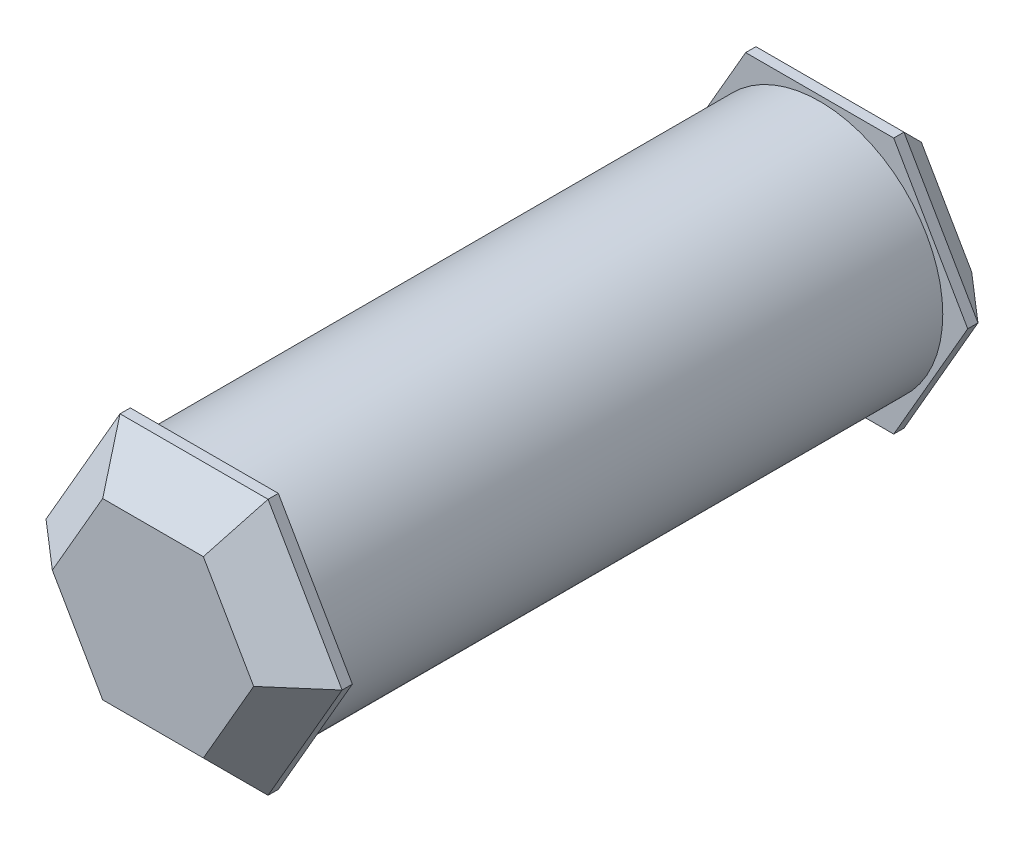
ISO-10303-21;
HEADER;
FILE_DESCRIPTION(('STEP AP214'),'2;1');
FILE_NAME('part.step','',(''),(''),'','','');
FILE_SCHEMA(('AUTOMOTIVE_DESIGN { 1 0 10303 214 1 1 1 1 }'));
ENDSEC;
DATA;
#1=APPLICATION_CONTEXT('core data for automotive mechanical design processes');
#2=APPLICATION_PROTOCOL_DEFINITION('international standard','automotive_design',2000,#1);
#3=PRODUCT_CONTEXT('',#1,'mechanical');
#4=PRODUCT('Part','Part','',(#3));
#5=PRODUCT_RELATED_PRODUCT_CATEGORY('part','',(#4));
#6=PRODUCT_DEFINITION_FORMATION('','',#4);
#7=PRODUCT_DEFINITION_CONTEXT('part definition',#1,'design');
#8=PRODUCT_DEFINITION('design','',#6,#7);
#9=PRODUCT_DEFINITION_SHAPE('','',#8);
#10=(LENGTH_UNIT() NAMED_UNIT(*) SI_UNIT(.MILLI.,.METRE.));
#11=(NAMED_UNIT(*) PLANE_ANGLE_UNIT() SI_UNIT($,.RADIAN.));
#12=(NAMED_UNIT(*) SI_UNIT($,.STERADIAN.) SOLID_ANGLE_UNIT());
#13=UNCERTAINTY_MEASURE_WITH_UNIT(LENGTH_MEASURE(1.E-05),#10,'distance_accuracy_value','');
#14=(GEOMETRIC_REPRESENTATION_CONTEXT(3) GLOBAL_UNCERTAINTY_ASSIGNED_CONTEXT((#13)) GLOBAL_UNIT_ASSIGNED_CONTEXT((#10,
#11,#12)) REPRESENTATION_CONTEXT('',''));
#15=CARTESIAN_POINT('',(0.,0.,0.));
#16=DIRECTION('',(0.,0.,1.));
#17=DIRECTION('',(1.,0.,0.));
#18=AXIS2_PLACEMENT_3D('',#15,#16,#17);
#19=CARTESIAN_POINT('',(0.,0.,6.));
#20=DIRECTION('',(0.,0.,-1.));
#21=DIRECTION('',(-1.,0.,0.));
#22=AXIS2_PLACEMENT_3D('',#19,#20,#21);
#23=CYLINDRICAL_SURFACE('',#22,1.2);
#24=CARTESIAN_POINT('',(0.,0.,6.));
#25=DIRECTION('',(0.,0.,1.));
#26=DIRECTION('',(1.,0.,0.));
#27=AXIS2_PLACEMENT_3D('',#24,#25,#26);
#28=CIRCLE('',#27,1.2);
#29=CARTESIAN_POINT('',(1.2,0.,6.));
#30=VERTEX_POINT('',#29);
#31=EDGE_CURVE('E269',#30,#30,#28,.T.);
#32=ORIENTED_EDGE('',*,*,#31,.F.);
#33=EDGE_LOOP('',(#32));
#34=FACE_BOUND('',#33,.T.);
#35=CARTESIAN_POINT('',(0.,0.,0.));
#36=DIRECTION('',(0.,0.,1.));
#37=DIRECTION('',(1.,0.,0.));
#38=AXIS2_PLACEMENT_3D('',#35,#36,#37);
#39=CIRCLE('',#38,1.2);
#40=CARTESIAN_POINT('',(1.2,0.,0.));
#41=VERTEX_POINT('',#40);
#42=EDGE_CURVE('E181',#41,#41,#39,.T.);
#43=ORIENTED_EDGE('',*,*,#42,.T.);
#44=EDGE_LOOP('',(#43));
#45=FACE_BOUND('',#44,.T.);
#46=ADVANCED_FACE('F44',(#34,#45),#23,.T.);
#47=CARTESIAN_POINT('',(0.721687836487033,-1.25,6.5));
#48=DIRECTION('',(-0.866025403784439,0.5,0.));
#49=DIRECTION('',(-0.5,-0.866025403784439,0.));
#50=AXIS2_PLACEMENT_3D('',#47,#48,#49);
#51=PLANE('',#50);
#52=DIRECTION('',(0.,0.,-1.));
#53=VECTOR('',#52,1.);
#54=CARTESIAN_POINT('',(1.44337567297407,0.,6.5));
#55=LINE('',#54,#53);
#56=CARTESIAN_POINT('',(1.44337567297407,0.,6.1));
#57=VERTEX_POINT('',#56);
#58=CARTESIAN_POINT('',(1.44337567297407,0.,6.));
#59=VERTEX_POINT('',#58);
#60=EDGE_CURVE('E266',#57,#59,#55,.T.);
#61=ORIENTED_EDGE('',*,*,#60,.F.);
#62=DIRECTION('',(-0.5,-0.866025403784439,0.));
#63=VECTOR('',#62,1.);
#64=CARTESIAN_POINT('',(0.721687836487033,-1.25,6.1));
#65=LINE('',#64,#63);
#66=CARTESIAN_POINT('',(0.721687836487033,-1.25,6.1));
#67=VERTEX_POINT('',#66);
#68=EDGE_CURVE('E300',#57,#67,#65,.T.);
#69=ORIENTED_EDGE('',*,*,#68,.T.);
#70=DIRECTION('',(0.,0.,-1.));
#71=VECTOR('',#70,1.);
#72=CARTESIAN_POINT('',(0.721687836487033,-1.25,6.5));
#73=LINE('',#72,#71);
#74=CARTESIAN_POINT('',(0.721687836487033,-1.25,6.));
#75=VERTEX_POINT('',#74);
#76=EDGE_CURVE('E251',#67,#75,#73,.T.);
#77=ORIENTED_EDGE('',*,*,#76,.T.);
#78=DIRECTION('',(0.5,0.866025403784439,0.));
#79=VECTOR('',#78,1.);
#80=CARTESIAN_POINT('',(0.721687836487033,-1.25,6.));
#81=LINE('',#80,#79);
#82=EDGE_CURVE('E227',#75,#59,#81,.T.);
#83=ORIENTED_EDGE('',*,*,#82,.T.);
#84=EDGE_LOOP('',(#61,#69,#77,#83));
#85=FACE_BOUND('',#84,.T.);
#86=ADVANCED_FACE('F433',(#85),#51,.F.);
#87=CARTESIAN_POINT('',(1.44337567297407,0.,6.5));
#88=DIRECTION('',(-0.866025403784439,-0.5,0.));
#89=DIRECTION('',(0.5,-0.866025403784439,0.));
#90=AXIS2_PLACEMENT_3D('',#87,#88,#89);
#91=PLANE('',#90);
#92=DIRECTION('',(0.,0.,-1.));
#93=VECTOR('',#92,1.);
#94=CARTESIAN_POINT('',(0.721687836487032,1.25,6.5));
#95=LINE('',#94,#93);
#96=CARTESIAN_POINT('',(0.721687836487032,1.25,6.1));
#97=VERTEX_POINT('',#96);
#98=CARTESIAN_POINT('',(0.721687836487032,1.25,6.));
#99=VERTEX_POINT('',#98);
#100=EDGE_CURVE('E263',#97,#99,#95,.T.);
#101=ORIENTED_EDGE('',*,*,#100,.F.);
#102=DIRECTION('',(0.5,-0.866025403784439,0.));
#103=VECTOR('',#102,1.);
#104=CARTESIAN_POINT('',(1.44337567297407,0.,6.1));
#105=LINE('',#104,#103);
#106=EDGE_CURVE('E290',#97,#57,#105,.T.);
#107=ORIENTED_EDGE('',*,*,#106,.T.);
#108=ORIENTED_EDGE('',*,*,#60,.T.);
#109=DIRECTION('',(-0.5,0.866025403784438,0.));
#110=VECTOR('',#109,1.);
#111=CARTESIAN_POINT('',(1.44337567297407,0.,6.));
#112=LINE('',#111,#110);
#113=EDGE_CURVE('E231',#59,#99,#112,.T.);
#114=ORIENTED_EDGE('',*,*,#113,.T.);
#115=EDGE_LOOP('',(#101,#107,#108,#114));
#116=FACE_BOUND('',#115,.T.);
#117=ADVANCED_FACE('F439',(#116),#91,.F.);
#118=CARTESIAN_POINT('',(0.721687836487032,1.25,6.5));
#119=DIRECTION('',(0.,-1.,0.));
#120=DIRECTION('',(1.,0.,0.));
#121=AXIS2_PLACEMENT_3D('',#118,#119,#120);
#122=PLANE('',#121);
#123=DIRECTION('',(0.,0.,-1.));
#124=VECTOR('',#123,1.);
#125=CARTESIAN_POINT('',(-0.721687836487033,1.25,6.5));
#126=LINE('',#125,#124);
#127=CARTESIAN_POINT('',(-0.721687836487033,1.25,6.1));
#128=VERTEX_POINT('',#127);
#129=CARTESIAN_POINT('',(-0.721687836487033,1.25,6.));
#130=VERTEX_POINT('',#129);
#131=EDGE_CURVE('E260',#128,#130,#126,.T.);
#132=ORIENTED_EDGE('',*,*,#131,.F.);
#133=DIRECTION('',(1.,0.,0.));
#134=VECTOR('',#133,1.);
#135=CARTESIAN_POINT('',(0.721687836487032,1.25,6.1));
#136=LINE('',#135,#134);
#137=EDGE_CURVE('E280',#128,#97,#136,.T.);
#138=ORIENTED_EDGE('',*,*,#137,.T.);
#139=ORIENTED_EDGE('',*,*,#100,.T.);
#140=DIRECTION('',(-1.,0.,0.));
#141=VECTOR('',#140,1.);
#142=CARTESIAN_POINT('',(0.721687836487032,1.25,6.));
#143=LINE('',#142,#141);
#144=EDGE_CURVE('E235',#99,#130,#143,.T.);
#145=ORIENTED_EDGE('',*,*,#144,.T.);
#146=EDGE_LOOP('',(#132,#138,#139,#145));
#147=FACE_BOUND('',#146,.T.);
#148=ADVANCED_FACE('F668',(#147),#122,.F.);
#149=CARTESIAN_POINT('',(-0.721687836487033,1.25,6.5));
#150=DIRECTION('',(0.866025403784439,-0.499999999999999,0.));
#151=DIRECTION('',(0.5,0.866025403784439,0.));
#152=AXIS2_PLACEMENT_3D('',#149,#150,#151);
#153=PLANE('',#152);
#154=DIRECTION('',(0.,0.,-1.));
#155=VECTOR('',#154,1.);
#156=CARTESIAN_POINT('',(-1.44337567297407,0.,6.5));
#157=LINE('',#156,#155);
#158=CARTESIAN_POINT('',(-1.44337567297407,0.,6.1));
#159=VERTEX_POINT('',#158);
#160=CARTESIAN_POINT('',(-1.44337567297407,0.,6.));
#161=VERTEX_POINT('',#160);
#162=EDGE_CURVE('E257',#159,#161,#157,.T.);
#163=ORIENTED_EDGE('',*,*,#162,.F.);
#164=DIRECTION('',(0.5,0.866025403784439,0.));
#165=VECTOR('',#164,1.);
#166=CARTESIAN_POINT('',(-0.952627944162883,0.850000000000001,6.1));
#167=LINE('',#166,#165);
#168=EDGE_CURVE('E331',#159,#128,#167,.T.);
#169=ORIENTED_EDGE('',*,*,#168,.T.);
#170=ORIENTED_EDGE('',*,*,#131,.T.);
#171=DIRECTION('',(-0.499999999999999,-0.866025403784439,0.));
#172=VECTOR('',#171,1.);
#173=CARTESIAN_POINT('',(-0.721687836487033,1.25,6.));
#174=LINE('',#173,#172);
#175=EDGE_CURVE('E239',#130,#161,#174,.T.);
#176=ORIENTED_EDGE('',*,*,#175,.T.);
#177=EDGE_LOOP('',(#163,#169,#170,#176));
#178=FACE_BOUND('',#177,.T.);
#179=ADVANCED_FACE('F657',(#178),#153,.F.);
#180=CARTESIAN_POINT('',(-1.44337567297407,0.,6.5));
#181=DIRECTION('',(0.866025403784439,0.5,0.));
#182=DIRECTION('',(-0.5,0.866025403784439,0.));
#183=AXIS2_PLACEMENT_3D('',#180,#181,#182);
#184=PLANE('',#183);
#185=DIRECTION('',(0.,0.,-1.));
#186=VECTOR('',#185,1.);
#187=CARTESIAN_POINT('',(-0.721687836487033,-1.25,6.5));
#188=LINE('',#187,#186);
#189=CARTESIAN_POINT('',(-0.721687836487033,-1.25,6.1));
#190=VERTEX_POINT('',#189);
#191=CARTESIAN_POINT('',(-0.721687836487033,-1.25,6.));
#192=VERTEX_POINT('',#191);
#193=EDGE_CURVE('E254',#190,#192,#188,.T.);
#194=ORIENTED_EDGE('',*,*,#193,.F.);
#195=DIRECTION('',(-0.5,0.866025403784439,0.));
#196=VECTOR('',#195,1.);
#197=CARTESIAN_POINT('',(-1.44337567297407,0.,6.1));
#198=LINE('',#197,#196);
#199=EDGE_CURVE('E320',#190,#159,#198,.T.);
#200=ORIENTED_EDGE('',*,*,#199,.T.);
#201=ORIENTED_EDGE('',*,*,#162,.T.);
#202=DIRECTION('',(0.5,-0.866025403784439,0.));
#203=VECTOR('',#202,1.);
#204=CARTESIAN_POINT('',(-1.44337567297407,0.,6.));
#205=LINE('',#204,#203);
#206=EDGE_CURVE('E243',#161,#192,#205,.T.);
#207=ORIENTED_EDGE('',*,*,#206,.T.);
#208=EDGE_LOOP('',(#194,#200,#201,#207));
#209=FACE_BOUND('',#208,.T.);
#210=ADVANCED_FACE('F652',(#209),#184,.F.);
#211=CARTESIAN_POINT('',(-0.721687836487033,-1.25,6.5));
#212=DIRECTION('',(0.,1.,0.));
#213=DIRECTION('',(0.,0.,1.));
#214=AXIS2_PLACEMENT_3D('',#211,#212,#213);
#215=PLANE('',#214);
#216=ORIENTED_EDGE('',*,*,#76,.F.);
#217=DIRECTION('',(-1.,0.,0.));
#218=VECTOR('',#217,1.);
#219=CARTESIAN_POINT('',(-0.721687836487033,-1.25,6.1));
#220=LINE('',#219,#218);
#221=EDGE_CURVE('E310',#67,#190,#220,.T.);
#222=ORIENTED_EDGE('',*,*,#221,.T.);
#223=ORIENTED_EDGE('',*,*,#193,.T.);
#224=DIRECTION('',(1.,0.,0.));
#225=VECTOR('',#224,1.);
#226=CARTESIAN_POINT('',(-0.721687836487033,-1.25,6.));
#227=LINE('',#226,#225);
#228=EDGE_CURVE('E247',#192,#75,#227,.T.);
#229=ORIENTED_EDGE('',*,*,#228,.T.);
#230=EDGE_LOOP('',(#216,#222,#223,#229));
#231=FACE_BOUND('',#230,.T.);
#232=ADVANCED_FACE('F643',(#231),#215,.F.);
#233=CARTESIAN_POINT('',(0.,0.,6.5));
#234=DIRECTION('',(0.,0.,1.));
#235=DIRECTION('',(1.,0.,0.));
#236=AXIS2_PLACEMENT_3D('',#233,#234,#235);
#237=PLANE('',#236);
#238=DIRECTION('',(-1.,0.,0.));
#239=VECTOR('',#238,1.);
#240=CARTESIAN_POINT('',(-0.721687836487033,0.850000000000001,6.5));
#241=LINE('',#240,#239);
#242=CARTESIAN_POINT('',(0.490747728811182,0.850000000000001,6.5));
#243=VERTEX_POINT('',#242);
#244=CARTESIAN_POINT('',(-0.490747728811184,0.850000000000001,6.5));
#245=VERTEX_POINT('',#244);
#246=EDGE_CURVE('E273',#243,#245,#241,.T.);
#247=ORIENTED_EDGE('',*,*,#246,.T.);
#248=DIRECTION('',(-0.5,-0.866025403784439,0.));
#249=VECTOR('',#248,1.);
#250=CARTESIAN_POINT('',(-0.86602540378444,0.200000000000001,6.5));
#251=LINE('',#250,#249);
#252=CARTESIAN_POINT('',(-0.981495457622365,0.,6.5));
#253=VERTEX_POINT('',#252);
#254=EDGE_CURVE('E324',#245,#253,#251,.T.);
#255=ORIENTED_EDGE('',*,*,#254,.T.);
#256=DIRECTION('',(0.5,-0.866025403784439,0.));
#257=VECTOR('',#256,1.);
#258=CARTESIAN_POINT('',(-0.606217782649107,-0.650000000000001,6.5));
#259=LINE('',#258,#257);
#260=CARTESIAN_POINT('',(-0.490747728811182,-0.850000000000001,6.5));
#261=VERTEX_POINT('',#260);
#262=EDGE_CURVE('E314',#253,#261,#259,.T.);
#263=ORIENTED_EDGE('',*,*,#262,.T.);
#264=DIRECTION('',(1.,0.,0.));
#265=VECTOR('',#264,1.);
#266=CARTESIAN_POINT('',(0.259807621135334,-0.850000000000001,6.5));
#267=LINE('',#266,#265);
#268=CARTESIAN_POINT('',(0.490747728811184,-0.850000000000001,6.5));
#269=VERTEX_POINT('',#268);
#270=EDGE_CURVE('E304',#261,#269,#267,.T.);
#271=ORIENTED_EDGE('',*,*,#270,.T.);
#272=DIRECTION('',(0.5,0.866025403784439,0.));
#273=VECTOR('',#272,1.);
#274=CARTESIAN_POINT('',(0.86602540378444,-0.200000000000001,6.5));
#275=LINE('',#274,#273);
#276=CARTESIAN_POINT('',(0.981495457622366,0.,6.5));
#277=VERTEX_POINT('',#276);
#278=EDGE_CURVE('E294',#269,#277,#275,.T.);
#279=ORIENTED_EDGE('',*,*,#278,.T.);
#280=DIRECTION('',(-0.5,0.866025403784439,0.));
#281=VECTOR('',#280,1.);
#282=CARTESIAN_POINT('',(0.606217782649107,0.650000000000001,6.5));
#283=LINE('',#282,#281);
#284=EDGE_CURVE('E284',#277,#243,#283,.T.);
#285=ORIENTED_EDGE('',*,*,#284,.T.);
#286=EDGE_LOOP('',(#247,#255,#263,#271,#279,#285));
#287=FACE_BOUND('',#286,.T.);
#288=ADVANCED_FACE('F638',(#287),#237,.T.);
#289=CARTESIAN_POINT('',(0.,0.,6.));
#290=DIRECTION('',(0.,0.,1.));
#291=DIRECTION('',(1.,0.,0.));
#292=AXIS2_PLACEMENT_3D('',#289,#290,#291);
#293=PLANE('',#292);
#294=ORIENTED_EDGE('',*,*,#31,.T.);
#295=EDGE_LOOP('',(#294));
#296=FACE_BOUND('',#295,.T.);
#297=ORIENTED_EDGE('',*,*,#82,.F.);
#298=ORIENTED_EDGE('',*,*,#228,.F.);
#299=ORIENTED_EDGE('',*,*,#206,.F.);
#300=ORIENTED_EDGE('',*,*,#175,.F.);
#301=ORIENTED_EDGE('',*,*,#144,.F.);
#302=ORIENTED_EDGE('',*,*,#113,.F.);
#303=EDGE_LOOP('',(#297,#298,#299,#300,#301,#302));
#304=FACE_BOUND('',#303,.T.);
#305=ADVANCED_FACE('F570',(#296,#304),#293,.F.);
#306=CARTESIAN_POINT('',(-0.721687836487047,-1.24999999999999,-0.5));
#307=DIRECTION('',(0.866025403784441,0.499999999999995,0.));
#308=DIRECTION('',(-0.499999999999995,0.866025403784441,0.));
#309=AXIS2_PLACEMENT_3D('',#306,#307,#308);
#310=PLANE('',#309);
#311=DIRECTION('',(0.,0.,1.));
#312=VECTOR('',#311,1.);
#313=CARTESIAN_POINT('',(-1.44337567297407,0.,-0.5));
#314=LINE('',#313,#312);
#315=CARTESIAN_POINT('',(-1.44337567297407,0.,-0.099999999999999));
#316=VERTEX_POINT('',#315);
#317=CARTESIAN_POINT('',(-1.44337567297407,0.,0.));
#318=VERTEX_POINT('',#317);
#319=EDGE_CURVE('E172',#316,#318,#314,.T.);
#320=ORIENTED_EDGE('',*,*,#319,.F.);
#321=DIRECTION('',(0.499999999999995,-0.866025403784441,0.));
#322=VECTOR('',#321,1.);
#323=CARTESIAN_POINT('',(-0.952627944162895,-0.849999999999991,-0.099999999999999));
#324=LINE('',#323,#322);
#325=CARTESIAN_POINT('',(-0.721687836487047,-1.24999999999999,-0.100000000000001));
#326=VERTEX_POINT('',#325);
#327=EDGE_CURVE('E378',#316,#326,#324,.T.);
#328=ORIENTED_EDGE('',*,*,#327,.T.);
#329=DIRECTION('',(0.,0.,1.));
#330=VECTOR('',#329,1.);
#331=CARTESIAN_POINT('',(-0.721687836487047,-1.24999999999999,-0.5));
#332=LINE('',#331,#330);
#333=CARTESIAN_POINT('',(-0.721687836487047,-1.24999999999999,0.));
#334=VERTEX_POINT('',#333);
#335=EDGE_CURVE('E196',#326,#334,#332,.T.);
#336=ORIENTED_EDGE('',*,*,#335,.T.);
#337=DIRECTION('',(-0.499999999999995,0.866025403784441,0.));
#338=VECTOR('',#337,1.);
#339=CARTESIAN_POINT('',(-0.721687836487047,-1.24999999999999,0.));
#340=LINE('',#339,#338);
#341=EDGE_CURVE('E188',#334,#318,#340,.T.);
#342=ORIENTED_EDGE('',*,*,#341,.T.);
#343=EDGE_LOOP('',(#320,#328,#336,#342));
#344=FACE_BOUND('',#343,.T.);
#345=ADVANCED_FACE('F194',(#344),#310,.F.);
#346=CARTESIAN_POINT('',(-1.44337567297407,0.,-0.5));
#347=DIRECTION('',(0.866025403784438,-0.500000000000001,0.));
#348=DIRECTION('',(0.500000000000001,0.866025403784438,0.));
#349=AXIS2_PLACEMENT_3D('',#346,#347,#348);
#350=PLANE('',#349);
#351=DIRECTION('',(0.,0.,1.));
#352=VECTOR('',#351,1.);
#353=CARTESIAN_POINT('',(-0.72168783648703,1.25,-0.5));
#354=LINE('',#353,#352);
#355=CARTESIAN_POINT('',(-0.72168783648703,1.25,-0.100000000000001));
#356=VERTEX_POINT('',#355);
#357=CARTESIAN_POINT('',(-0.72168783648703,1.25,0.));
#358=VERTEX_POINT('',#357);
#359=EDGE_CURVE('E182',#356,#358,#354,.T.);
#360=ORIENTED_EDGE('',*,*,#359,.F.);
#361=DIRECTION('',(-0.500000000000001,-0.866025403784438,0.));
#362=VECTOR('',#361,1.);
#363=CARTESIAN_POINT('',(-1.21243556529821,0.4,-0.099999999999998));
#364=LINE('',#363,#362);
#365=EDGE_CURVE('E54',#356,#316,#364,.T.);
#366=ORIENTED_EDGE('',*,*,#365,.T.);
#367=ORIENTED_EDGE('',*,*,#319,.T.);
#368=DIRECTION('',(0.500000000000001,0.866025403784438,0.));
#369=VECTOR('',#368,1.);
#370=CARTESIAN_POINT('',(-1.44337567297407,0.,0.));
#371=LINE('',#370,#369);
#372=EDGE_CURVE('E176',#318,#358,#371,.T.);
#373=ORIENTED_EDGE('',*,*,#372,.T.);
#374=EDGE_LOOP('',(#360,#366,#367,#373));
#375=FACE_BOUND('',#374,.T.);
#376=ADVANCED_FACE('F175',(#375),#350,.F.);
#377=CARTESIAN_POINT('',(-0.72168783648703,1.25,-0.5));
#378=DIRECTION('',(0.,-1.,0.));
#379=DIRECTION('',(1.,0.,0.));
#380=AXIS2_PLACEMENT_3D('',#377,#378,#379);
#381=PLANE('',#380);
#382=DIRECTION('',(0.,0.,1.));
#383=VECTOR('',#382,1.);
#384=CARTESIAN_POINT('',(0.721687836487038,1.25,-0.5));
#385=LINE('',#384,#383);
#386=CARTESIAN_POINT('',(0.721687836487038,1.25,-0.0999999999999999));
#387=VERTEX_POINT('',#386);
#388=CARTESIAN_POINT('',(0.721687836487038,1.25,0.));
#389=VERTEX_POINT('',#388);
#390=EDGE_CURVE('E222',#387,#389,#385,.T.);
#391=ORIENTED_EDGE('',*,*,#390,.F.);
#392=DIRECTION('',(-1.,0.,0.));
#393=VECTOR('',#392,1.);
#394=CARTESIAN_POINT('',(-0.72168783648703,1.25,-0.100000000000001));
#395=LINE('',#394,#393);
#396=EDGE_CURVE('E361',#387,#356,#395,.T.);
#397=ORIENTED_EDGE('',*,*,#396,.T.);
#398=ORIENTED_EDGE('',*,*,#359,.T.);
#399=DIRECTION('',(1.,0.,0.));
#400=VECTOR('',#399,1.);
#401=CARTESIAN_POINT('',(-0.72168783648703,1.25,0.));
#402=LINE('',#401,#400);
#403=EDGE_CURVE('E191',#358,#389,#402,.T.);
#404=ORIENTED_EDGE('',*,*,#403,.T.);
#405=EDGE_LOOP('',(#391,#397,#398,#404));
#406=FACE_BOUND('',#405,.T.);
#407=ADVANCED_FACE('F396',(#406),#381,.F.);
#408=CARTESIAN_POINT('',(0.721687836487038,1.25,-0.5));
#409=DIRECTION('',(-0.866025403784441,-0.499999999999995,0.));
#410=DIRECTION('',(0.499999999999995,-0.866025403784441,0.));
#411=AXIS2_PLACEMENT_3D('',#408,#409,#410);
#412=PLANE('',#411);
#413=DIRECTION('',(0.,0.,1.));
#414=VECTOR('',#413,1.);
#415=CARTESIAN_POINT('',(1.44337567297406,0.,-0.5));
#416=LINE('',#415,#414);
#417=CARTESIAN_POINT('',(1.44337567297406,0.,-0.0999999999999999));
#418=VERTEX_POINT('',#417);
#419=CARTESIAN_POINT('',(1.44337567297406,0.,0.));
#420=VERTEX_POINT('',#419);
#421=EDGE_CURVE('E219',#418,#420,#416,.T.);
#422=ORIENTED_EDGE('',*,*,#421,.F.);
#423=DIRECTION('',(-0.499999999999995,0.866025403784441,0.));
#424=VECTOR('',#423,1.);
#425=CARTESIAN_POINT('',(0.721687836487038,1.25,-0.0999999999999999));
#426=LINE('',#425,#424);
#427=EDGE_CURVE('E351',#418,#387,#426,.T.);
#428=ORIENTED_EDGE('',*,*,#427,.T.);
#429=ORIENTED_EDGE('',*,*,#390,.T.);
#430=DIRECTION('',(0.499999999999995,-0.866025403784441,0.));
#431=VECTOR('',#430,1.);
#432=CARTESIAN_POINT('',(0.721687836487038,1.25,0.));
#433=LINE('',#432,#431);
#434=EDGE_CURVE('E203',#389,#420,#433,.T.);
#435=ORIENTED_EDGE('',*,*,#434,.T.);
#436=EDGE_LOOP('',(#422,#428,#429,#435));
#437=FACE_BOUND('',#436,.T.);
#438=ADVANCED_FACE('F423',(#437),#412,.F.);
#439=CARTESIAN_POINT('',(1.44337567297406,0.,-0.5));
#440=DIRECTION('',(-0.866025403784435,0.500000000000007,0.));
#441=DIRECTION('',(-0.500000000000007,-0.866025403784435,0.));
#442=AXIS2_PLACEMENT_3D('',#439,#440,#441);
#443=PLANE('',#442);
#444=DIRECTION('',(0.,0.,1.));
#445=VECTOR('',#444,1.);
#446=CARTESIAN_POINT('',(0.721687836487021,-1.25000000000001,-0.5));
#447=LINE('',#446,#445);
#448=CARTESIAN_POINT('',(0.721687836487021,-1.25000000000001,-0.0999999999999999));
#449=VERTEX_POINT('',#448);
#450=CARTESIAN_POINT('',(0.721687836487021,-1.25000000000001,0.));
#451=VERTEX_POINT('',#450);
#452=EDGE_CURVE('E216',#449,#451,#447,.T.);
#453=ORIENTED_EDGE('',*,*,#452,.F.);
#454=DIRECTION('',(0.500000000000007,0.866025403784435,0.));
#455=VECTOR('',#454,1.);
#456=CARTESIAN_POINT('',(1.44337567297406,0.,-0.0999999999999999));
#457=LINE('',#456,#455);
#458=EDGE_CURVE('E341',#449,#418,#457,.T.);
#459=ORIENTED_EDGE('',*,*,#458,.T.);
#460=ORIENTED_EDGE('',*,*,#421,.T.);
#461=DIRECTION('',(-0.500000000000007,-0.866025403784435,0.));
#462=VECTOR('',#461,1.);
#463=CARTESIAN_POINT('',(1.44337567297406,0.,0.));
#464=LINE('',#463,#462);
#465=EDGE_CURVE('E207',#420,#451,#464,.T.);
#466=ORIENTED_EDGE('',*,*,#465,.T.);
#467=EDGE_LOOP('',(#453,#459,#460,#466));
#468=FACE_BOUND('',#467,.T.);
#469=ADVANCED_FACE('F411',(#468),#443,.F.);
#470=CARTESIAN_POINT('',(0.721687836487021,-1.25000000000001,-0.5));
#471=DIRECTION('',(0.,1.,0.));
#472=DIRECTION('',(-1.,0.,0.));
#473=AXIS2_PLACEMENT_3D('',#470,#471,#472);
#474=PLANE('',#473);
#475=ORIENTED_EDGE('',*,*,#335,.F.);
#476=DIRECTION('',(1.,0.,0.));
#477=VECTOR('',#476,1.);
#478=CARTESIAN_POINT('',(0.259807621135323,-1.25,-0.100000000000001));
#479=LINE('',#478,#477);
#480=EDGE_CURVE('E369',#326,#449,#479,.T.);
#481=ORIENTED_EDGE('',*,*,#480,.T.);
#482=ORIENTED_EDGE('',*,*,#452,.T.);
#483=DIRECTION('',(-1.,0.,0.));
#484=VECTOR('',#483,1.);
#485=CARTESIAN_POINT('',(0.721687836487021,-1.25000000000001,0.));
#486=LINE('',#485,#484);
#487=EDGE_CURVE('E211',#451,#334,#486,.T.);
#488=ORIENTED_EDGE('',*,*,#487,.T.);
#489=EDGE_LOOP('',(#475,#481,#482,#488));
#490=FACE_BOUND('',#489,.T.);
#491=ADVANCED_FACE('F408',(#490),#474,.F.);
#492=CARTESIAN_POINT('',(0.,0.,-0.5));
#493=DIRECTION('',(0.,0.,-1.));
#494=DIRECTION('',(-1.,0.,0.));
#495=AXIS2_PLACEMENT_3D('',#492,#493,#494);
#496=PLANE('',#495);
#497=DIRECTION('',(-0.499999999999995,0.866025403784441,0.));
#498=VECTOR('',#497,1.);
#499=CARTESIAN_POINT('',(-1.09696551146029,0.199999999999998,-0.5));
#500=LINE('',#499,#498);
#501=CARTESIAN_POINT('',(-0.490747728811193,-0.849999999999995,-0.5));
#502=VERTEX_POINT('',#501);
#503=CARTESIAN_POINT('',(-0.981495457622365,0.,-0.5));
#504=VERTEX_POINT('',#503);
#505=EDGE_CURVE('E375',#502,#504,#500,.T.);
#506=ORIENTED_EDGE('',*,*,#505,.T.);
#507=DIRECTION('',(0.500000000000001,0.866025403784438,0.));
#508=VECTOR('',#507,1.);
#509=CARTESIAN_POINT('',(-0.606217782649105,0.650000000000003,-0.5));
#510=LINE('',#509,#508);
#511=CARTESIAN_POINT('',(-0.49074772881118,0.850000000000002,-0.5));
#512=VERTEX_POINT('',#511);
#513=EDGE_CURVE('E384',#504,#512,#510,.T.);
#514=ORIENTED_EDGE('',*,*,#513,.T.);
#515=DIRECTION('',(1.,0.,0.));
#516=VECTOR('',#515,1.);
#517=CARTESIAN_POINT('',(0.259807621135339,0.85,-0.5));
#518=LINE('',#517,#516);
#519=CARTESIAN_POINT('',(0.490747728811188,0.849999999999999,-0.5));
#520=VERTEX_POINT('',#519);
#521=EDGE_CURVE('E355',#512,#520,#518,.T.);
#522=ORIENTED_EDGE('',*,*,#521,.T.);
#523=DIRECTION('',(0.499999999999995,-0.866025403784441,0.));
#524=VECTOR('',#523,1.);
#525=CARTESIAN_POINT('',(0.866025403784443,0.199999999999992,-0.5));
#526=LINE('',#525,#524);
#527=CARTESIAN_POINT('',(0.981495457622366,0.,-0.5));
#528=VERTEX_POINT('',#527);
#529=EDGE_CURVE('E345',#520,#528,#526,.T.);
#530=ORIENTED_EDGE('',*,*,#529,.T.);
#531=DIRECTION('',(-0.500000000000007,-0.866025403784435,0.));
#532=VECTOR('',#531,1.);
#533=CARTESIAN_POINT('',(0.375277674973249,-1.05,-0.5));
#534=LINE('',#533,#532);
#535=CARTESIAN_POINT('',(0.490747728811176,-0.850000000000005,-0.5));
#536=VERTEX_POINT('',#535);
#537=EDGE_CURVE('E337',#528,#536,#534,.T.);
#538=ORIENTED_EDGE('',*,*,#537,.T.);
#539=DIRECTION('',(-1.,0.,0.));
#540=VECTOR('',#539,1.);
#541=CARTESIAN_POINT('',(-0.721687836487043,-0.849999999999993,-0.5));
#542=LINE('',#541,#540);
#543=EDGE_CURVE('E365',#536,#502,#542,.T.);
#544=ORIENTED_EDGE('',*,*,#543,.T.);
#545=EDGE_LOOP('',(#506,#514,#522,#530,#538,#544));
#546=FACE_BOUND('',#545,.T.);
#547=ADVANCED_FACE('F398',(#546),#496,.T.);
#548=CARTESIAN_POINT('',(0.,0.,0.));
#549=DIRECTION('',(0.,0.,-1.));
#550=DIRECTION('',(-1.,0.,0.));
#551=AXIS2_PLACEMENT_3D('',#548,#549,#550);
#552=PLANE('',#551);
#553=ORIENTED_EDGE('',*,*,#42,.F.);
#554=EDGE_LOOP('',(#553));
#555=FACE_BOUND('',#554,.T.);
#556=ORIENTED_EDGE('',*,*,#341,.F.);
#557=ORIENTED_EDGE('',*,*,#487,.F.);
#558=ORIENTED_EDGE('',*,*,#465,.F.);
#559=ORIENTED_EDGE('',*,*,#434,.F.);
#560=ORIENTED_EDGE('',*,*,#403,.F.);
#561=ORIENTED_EDGE('',*,*,#372,.F.);
#562=EDGE_LOOP('',(#556,#557,#558,#559,#560,#561));
#563=FACE_BOUND('',#562,.T.);
#564=ADVANCED_FACE('F186',(#555,#563),#552,.F.);
#565=CARTESIAN_POINT('',(0.,0.850000000000001,6.5));
#566=DIRECTION('',(0.,0.707106781186548,0.707106781186547));
#567=DIRECTION('',(1.,0.,0.));
#568=AXIS2_PLACEMENT_3D('',#565,#566,#567);
#569=PLANE('',#568);
#570=ORIENTED_EDGE('',*,*,#137,.F.);
#571=DIRECTION('',(0.377964473009227,-0.654653670707977,0.654653670707978));
#572=VECTOR('',#571,1.);
#573=CARTESIAN_POINT('',(-0.420640910409587,0.728571428571429,6.62142857142857));
#574=LINE('',#573,#572);
#575=EDGE_CURVE('E334',#128,#245,#574,.T.);
#576=ORIENTED_EDGE('',*,*,#575,.T.);
#577=ORIENTED_EDGE('',*,*,#246,.F.);
#578=DIRECTION('',(0.377964473009227,0.654653670707977,-0.654653670707978));
#579=VECTOR('',#578,1.);
#580=CARTESIAN_POINT('',(0.420640910409584,0.72857142857143,6.62142857142857));
#581=LINE('',#580,#579);
#582=EDGE_CURVE('E287',#243,#97,#581,.T.);
#583=ORIENTED_EDGE('',*,*,#582,.T.);
#584=EDGE_LOOP('',(#570,#576,#577,#583));
#585=FACE_BOUND('',#584,.T.);
#586=ADVANCED_FACE('F447',(#585),#569,.T.);
#587=CARTESIAN_POINT('',(0.736121593216773,0.425,6.5));
#588=DIRECTION('',(0.612372435695795,0.353553390593274,0.707106781186547));
#589=DIRECTION('',(0.5,-0.866025403784439,0.));
#590=AXIS2_PLACEMENT_3D('',#587,#588,#589);
#591=PLANE('',#590);
#592=ORIENTED_EDGE('',*,*,#284,.F.);
#593=DIRECTION('',(0.755928946018454,0.,-0.654653670707978));
#594=VECTOR('',#593,1.);
#595=CARTESIAN_POINT('',(0.841281820819171,0.,6.62142857142857));
#596=LINE('',#595,#594);
#597=EDGE_CURVE('E297',#277,#57,#596,.T.);
#598=ORIENTED_EDGE('',*,*,#597,.T.);
#599=ORIENTED_EDGE('',*,*,#106,.F.);
#600=ORIENTED_EDGE('',*,*,#582,.F.);
#601=EDGE_LOOP('',(#592,#598,#599,#600));
#602=FACE_BOUND('',#601,.T.);
#603=ADVANCED_FACE('F453',(#602),#591,.T.);
#604=CARTESIAN_POINT('',(0.736121593216775,-0.425000000000001,6.5));
#605=DIRECTION('',(0.612372435695796,-0.353553390593274,0.707106781186546));
#606=DIRECTION('',(-0.5,-0.866025403784439,0.));
#607=AXIS2_PLACEMENT_3D('',#604,#605,#606);
#608=PLANE('',#607);
#609=ORIENTED_EDGE('',*,*,#278,.F.);
#610=DIRECTION('',(0.377964473009226,-0.654653670707977,-0.654653670707978));
#611=VECTOR('',#610,1.);
#612=CARTESIAN_POINT('',(0.420640910409587,-0.728571428571429,6.62142857142857));
#613=LINE('',#612,#611);
#614=EDGE_CURVE('E307',#269,#67,#613,.T.);
#615=ORIENTED_EDGE('',*,*,#614,.T.);
#616=ORIENTED_EDGE('',*,*,#68,.F.);
#617=ORIENTED_EDGE('',*,*,#597,.F.);
#618=EDGE_LOOP('',(#609,#615,#616,#617));
#619=FACE_BOUND('',#618,.T.);
#620=ADVANCED_FACE('F460',(#619),#608,.T.);
#621=CARTESIAN_POINT('',(0.,-0.850000000000001,6.5));
#622=DIRECTION('',(0.,-0.707106781186548,0.707106781186547));
#623=DIRECTION('',(-1.,0.,0.));
#624=AXIS2_PLACEMENT_3D('',#621,#622,#623);
#625=PLANE('',#624);
#626=ORIENTED_EDGE('',*,*,#270,.F.);
#627=DIRECTION('',(-0.377964473009227,-0.654653670707977,-0.654653670707978));
#628=VECTOR('',#627,1.);
#629=CARTESIAN_POINT('',(-0.420640910409585,-0.728571428571429,6.62142857142857));
#630=LINE('',#629,#628);
#631=EDGE_CURVE('E317',#261,#190,#630,.T.);
#632=ORIENTED_EDGE('',*,*,#631,.T.);
#633=ORIENTED_EDGE('',*,*,#221,.F.);
#634=ORIENTED_EDGE('',*,*,#614,.F.);
#635=EDGE_LOOP('',(#626,#632,#633,#634));
#636=FACE_BOUND('',#635,.T.);
#637=ADVANCED_FACE('F467',(#636),#625,.T.);
#638=CARTESIAN_POINT('',(-0.736121593216773,-0.425,6.5));
#639=DIRECTION('',(-0.612372435695795,-0.353553390593274,0.707106781186547));
#640=DIRECTION('',(-0.5,0.866025403784439,0.));
#641=AXIS2_PLACEMENT_3D('',#638,#639,#640);
#642=PLANE('',#641);
#643=ORIENTED_EDGE('',*,*,#262,.F.);
#644=DIRECTION('',(-0.755928946018454,0.,-0.654653670707978));
#645=VECTOR('',#644,1.);
#646=CARTESIAN_POINT('',(-0.84128182081917,0.,6.62142857142857));
#647=LINE('',#646,#645);
#648=EDGE_CURVE('E328',#253,#159,#647,.T.);
#649=ORIENTED_EDGE('',*,*,#648,.T.);
#650=ORIENTED_EDGE('',*,*,#199,.F.);
#651=ORIENTED_EDGE('',*,*,#631,.F.);
#652=EDGE_LOOP('',(#643,#649,#650,#651));
#653=FACE_BOUND('',#652,.T.);
#654=ADVANCED_FACE('F474',(#653),#642,.T.);
#655=CARTESIAN_POINT('',(-0.736121593216775,0.425000000000001,6.5));
#656=DIRECTION('',(-0.612372435695796,0.353553390593274,0.707106781186546));
#657=DIRECTION('',(0.5,0.866025403784439,0.));
#658=AXIS2_PLACEMENT_3D('',#655,#656,#657);
#659=PLANE('',#658);
#660=ORIENTED_EDGE('',*,*,#575,.F.);
#661=ORIENTED_EDGE('',*,*,#168,.F.);
#662=ORIENTED_EDGE('',*,*,#648,.F.);
#663=ORIENTED_EDGE('',*,*,#254,.F.);
#664=EDGE_LOOP('',(#660,#661,#662,#663));
#665=FACE_BOUND('',#664,.T.);
#666=ADVANCED_FACE('F481',(#665),#659,.T.);
#667=CARTESIAN_POINT('',(0.736121593216771,-0.425000000000006,-0.5));
#668=DIRECTION('',(0.612372435695793,-0.353553390593279,-0.707106781186546));
#669=DIRECTION('',(0.500000000000007,0.866025403784435,0.));
#670=AXIS2_PLACEMENT_3D('',#667,#668,#669);
#671=PLANE('',#670);
#672=ORIENTED_EDGE('',*,*,#458,.F.);
#673=DIRECTION('',(-0.377964473009219,0.654653670707982,-0.654653670707978));
#674=VECTOR('',#673,1.);
#675=CARTESIAN_POINT('',(0.420640910409579,-0.728571428571432,-0.621428571428573));
#676=LINE('',#675,#674);
#677=EDGE_CURVE('E372',#449,#536,#676,.T.);
#678=ORIENTED_EDGE('',*,*,#677,.T.);
#679=ORIENTED_EDGE('',*,*,#537,.F.);
#680=DIRECTION('',(0.755928946018453,0.,0.654653670707979));
#681=VECTOR('',#680,1.);
#682=CARTESIAN_POINT('',(0.841281820819171,0.,-0.621428571428572));
#683=LINE('',#682,#681);
#684=EDGE_CURVE('E348',#528,#418,#683,.T.);
#685=ORIENTED_EDGE('',*,*,#684,.T.);
#686=EDGE_LOOP('',(#672,#678,#679,#685));
#687=FACE_BOUND('',#686,.T.);
#688=ADVANCED_FACE('F415',(#687),#671,.T.);
#689=CARTESIAN_POINT('',(0.736121593216777,0.424999999999997,-0.5));
#690=DIRECTION('',(0.612372435695798,0.353553390593271,-0.707106781186546));
#691=DIRECTION('',(-0.499999999999995,0.866025403784441,0.));
#692=AXIS2_PLACEMENT_3D('',#689,#690,#691);
#693=PLANE('',#692);
#694=ORIENTED_EDGE('',*,*,#529,.F.);
#695=DIRECTION('',(0.377964473009227,0.654653670707977,0.654653670707978));
#696=VECTOR('',#695,1.);
#697=CARTESIAN_POINT('',(0.420640910409589,0.728571428571426,-0.621428571428573));
#698=LINE('',#697,#696);
#699=EDGE_CURVE('E358',#520,#387,#698,.T.);
#700=ORIENTED_EDGE('',*,*,#699,.T.);
#701=ORIENTED_EDGE('',*,*,#427,.F.);
#702=ORIENTED_EDGE('',*,*,#684,.F.);
#703=EDGE_LOOP('',(#694,#700,#701,#702));
#704=FACE_BOUND('',#703,.T.);
#705=ADVANCED_FACE('F421',(#704),#693,.T.);
#706=CARTESIAN_POINT('',(0.,0.850000000000001,-0.5));
#707=DIRECTION('',(0.,0.707106781186547,-0.707106781186547));
#708=DIRECTION('',(-1.,0.,0.));
#709=AXIS2_PLACEMENT_3D('',#706,#707,#708);
#710=PLANE('',#709);
#711=ORIENTED_EDGE('',*,*,#521,.F.);
#712=DIRECTION('',(-0.377964473009222,0.654653670707979,0.654653670707978));
#713=VECTOR('',#712,1.);
#714=CARTESIAN_POINT('',(-0.420640910409584,0.728571428571431,-0.621428571428571));
#715=LINE('',#714,#713);
#716=EDGE_CURVE('E61',#512,#356,#715,.T.);
#717=ORIENTED_EDGE('',*,*,#716,.T.);
#718=ORIENTED_EDGE('',*,*,#396,.F.);
#719=ORIENTED_EDGE('',*,*,#699,.F.);
#720=EDGE_LOOP('',(#711,#717,#718,#719));
#721=FACE_BOUND('',#720,.T.);
#722=ADVANCED_FACE('F392',(#721),#710,.T.);
#723=CARTESIAN_POINT('',(0.,-0.85,-0.5));
#724=DIRECTION('',(0.,-0.707106781186547,-0.707106781186547));
#725=DIRECTION('',(1.,0.,0.));
#726=AXIS2_PLACEMENT_3D('',#723,#724,#725);
#727=PLANE('',#726);
#728=ORIENTED_EDGE('',*,*,#480,.F.);
#729=DIRECTION('',(0.37796447300923,0.654653670707974,-0.654653670707978));
#730=VECTOR('',#729,1.);
#731=CARTESIAN_POINT('',(-0.420640910409596,-0.728571428571425,-0.621428571428571));
#732=LINE('',#731,#730);
#733=EDGE_CURVE('E381',#326,#502,#732,.T.);
#734=ORIENTED_EDGE('',*,*,#733,.T.);
#735=ORIENTED_EDGE('',*,*,#543,.F.);
#736=ORIENTED_EDGE('',*,*,#677,.F.);
#737=EDGE_LOOP('',(#728,#734,#735,#736));
#738=FACE_BOUND('',#737,.T.);
#739=ADVANCED_FACE('F404',(#738),#727,.T.);
#740=CARTESIAN_POINT('',(-0.736121593216779,-0.424999999999998,-0.5));
#741=DIRECTION('',(-0.612372435695797,-0.353553390593271,-0.707106781186546));
#742=DIRECTION('',(0.499999999999995,-0.866025403784441,0.));
#743=AXIS2_PLACEMENT_3D('',#740,#741,#742);
#744=PLANE('',#743);
#745=ORIENTED_EDGE('',*,*,#327,.F.);
#746=DIRECTION('',(0.755928946018453,0.,-0.654653670707979));
#747=VECTOR('',#746,1.);
#748=CARTESIAN_POINT('',(-0.841281820819174,0.,-0.621428571428569));
#749=LINE('',#748,#747);
#750=EDGE_CURVE('E11',#316,#504,#749,.T.);
#751=ORIENTED_EDGE('',*,*,#750,.T.);
#752=ORIENTED_EDGE('',*,*,#505,.F.);
#753=ORIENTED_EDGE('',*,*,#733,.F.);
#754=EDGE_LOOP('',(#745,#751,#752,#753));
#755=FACE_BOUND('',#754,.T.);
#756=ADVANCED_FACE('F401',(#755),#744,.T.);
#757=CARTESIAN_POINT('',(-0.736121593216773,0.425000000000001,-0.5));
#758=DIRECTION('',(-0.612372435695796,0.353553390593275,-0.707106781186545));
#759=DIRECTION('',(-0.500000000000001,-0.866025403784438,0.));
#760=AXIS2_PLACEMENT_3D('',#757,#758,#759);
#761=PLANE('',#760);
#762=ORIENTED_EDGE('',*,*,#750,.F.);
#763=ORIENTED_EDGE('',*,*,#365,.F.);
#764=ORIENTED_EDGE('',*,*,#716,.F.);
#765=ORIENTED_EDGE('',*,*,#513,.F.);
#766=EDGE_LOOP('',(#762,#763,#764,#765));
#767=FACE_BOUND('',#766,.T.);
#768=ADVANCED_FACE('F47',(#767),#761,.T.);
#769=CLOSED_SHELL('',(#46,#86,#117,#148,#179,#210,#232,#288,#305,#345,#376,#407,#438,#469,#491,
#547,#564,#586,#603,#620,#637,#654,#666,#688,#705,#722,#739,#756,#768));
#770=MANIFOLD_SOLID_BREP('B2',#769);
#771=ADVANCED_BREP_SHAPE_REPRESENTATION('',(#18,#770),#14);
#772=SHAPE_DEFINITION_REPRESENTATION(#9,#771);
ENDSEC;
END-ISO-10303-21;
